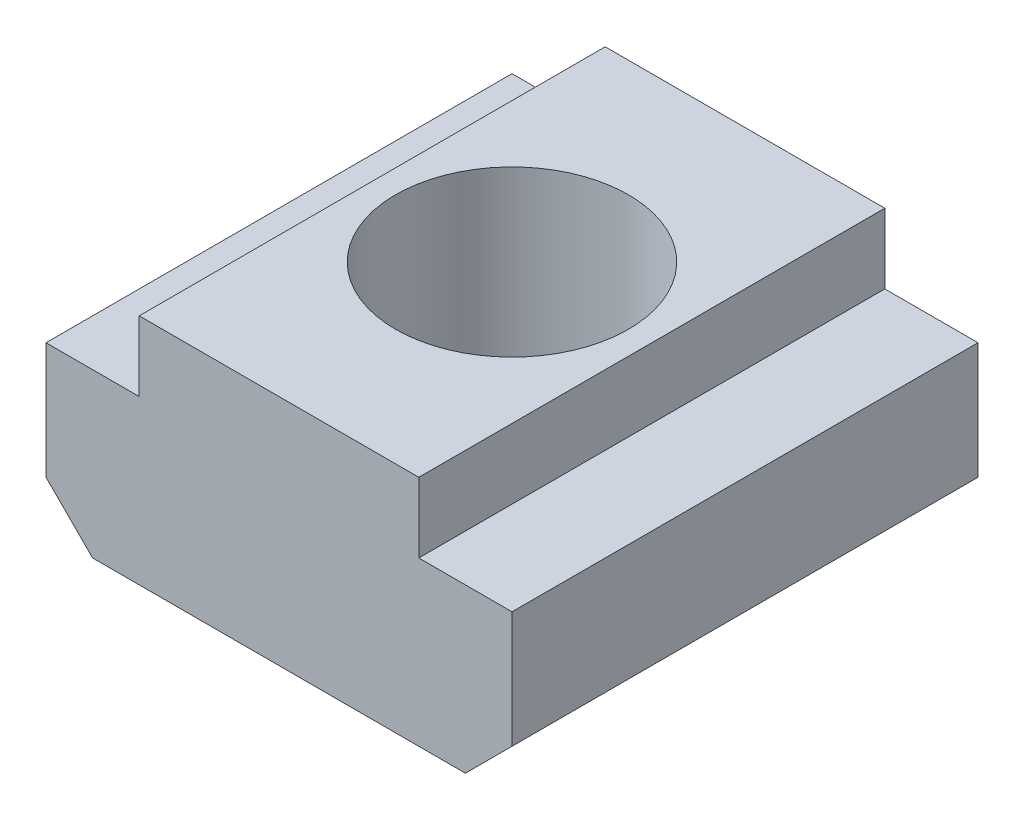
ISO-10303-21;
HEADER;
FILE_DESCRIPTION(('STEP AP214'),'2;1');
FILE_NAME('part.step','',(''),(''),'','','');
FILE_SCHEMA(('AUTOMOTIVE_DESIGN { 1 0 10303 214 1 1 1 1 }'));
ENDSEC;
DATA;
#1=APPLICATION_CONTEXT('core data for automotive mechanical design processes');
#2=APPLICATION_PROTOCOL_DEFINITION('international standard','automotive_design',2000,#1);
#3=PRODUCT_CONTEXT('',#1,'mechanical');
#4=PRODUCT('Part','Part','',(#3));
#5=PRODUCT_RELATED_PRODUCT_CATEGORY('part','',(#4));
#6=PRODUCT_DEFINITION_FORMATION('','',#4);
#7=PRODUCT_DEFINITION_CONTEXT('part definition',#1,'design');
#8=PRODUCT_DEFINITION('design','',#6,#7);
#9=PRODUCT_DEFINITION_SHAPE('','',#8);
#10=(LENGTH_UNIT() NAMED_UNIT(*) SI_UNIT(.MILLI.,.METRE.));
#11=(NAMED_UNIT(*) PLANE_ANGLE_UNIT() SI_UNIT($,.RADIAN.));
#12=(NAMED_UNIT(*) SI_UNIT($,.STERADIAN.) SOLID_ANGLE_UNIT());
#13=UNCERTAINTY_MEASURE_WITH_UNIT(LENGTH_MEASURE(1.E-05),#10,'distance_accuracy_value','');
#14=(GEOMETRIC_REPRESENTATION_CONTEXT(3) GLOBAL_UNCERTAINTY_ASSIGNED_CONTEXT((#13)) GLOBAL_UNIT_ASSIGNED_CONTEXT((#10,
#11,#12)) REPRESENTATION_CONTEXT('',''));
#15=CARTESIAN_POINT('',(0.,0.,0.));
#16=DIRECTION('',(0.,0.,1.));
#17=DIRECTION('',(1.,0.,0.));
#18=AXIS2_PLACEMENT_3D('',#15,#16,#17);
#19=CARTESIAN_POINT('',(-5.,1.,10.));
#20=DIRECTION('',(0.707106781186548,0.707106781186548,0.));
#21=DIRECTION('',(-0.707106781186548,0.707106781186548,0.));
#22=AXIS2_PLACEMENT_3D('',#19,#20,#21);
#23=PLANE('',#22);
#24=DIRECTION('',(0.707106781186548,-0.707106781186548,0.));
#25=VECTOR('',#24,1.);
#26=CARTESIAN_POINT('',(-5.,1.,0.));
#27=LINE('',#26,#25);
#28=CARTESIAN_POINT('',(-5.,1.,0.));
#29=VERTEX_POINT('',#28);
#30=CARTESIAN_POINT('',(-4.,0.,0.));
#31=VERTEX_POINT('',#30);
#32=EDGE_CURVE('E145',#29,#31,#27,.T.);
#33=ORIENTED_EDGE('',*,*,#32,.T.);
#34=DIRECTION('',(0.,0.,-1.));
#35=VECTOR('',#34,1.);
#36=CARTESIAN_POINT('',(-4.,0.,10.));
#37=LINE('',#36,#35);
#38=CARTESIAN_POINT('',(-4.,0.,10.));
#39=VERTEX_POINT('',#38);
#40=EDGE_CURVE('E11',#39,#31,#37,.T.);
#41=ORIENTED_EDGE('',*,*,#40,.F.);
#42=DIRECTION('',(0.707106781186548,-0.707106781186548,0.));
#43=VECTOR('',#42,1.);
#44=CARTESIAN_POINT('',(-5.,1.,10.));
#45=LINE('',#44,#43);
#46=CARTESIAN_POINT('',(-5.,1.,10.));
#47=VERTEX_POINT('',#46);
#48=EDGE_CURVE('E164',#47,#39,#45,.T.);
#49=ORIENTED_EDGE('',*,*,#48,.F.);
#50=DIRECTION('',(0.,0.,-1.));
#51=VECTOR('',#50,1.);
#52=CARTESIAN_POINT('',(-5.,1.,10.));
#53=LINE('',#52,#51);
#54=EDGE_CURVE('E141',#47,#29,#53,.T.);
#55=ORIENTED_EDGE('',*,*,#54,.T.);
#56=EDGE_LOOP('',(#33,#41,#49,#55));
#57=FACE_BOUND('',#56,.T.);
#58=ADVANCED_FACE('F37',(#57),#23,.F.);
#59=CARTESIAN_POINT('',(-4.,0.,10.));
#60=DIRECTION('',(0.,1.,0.));
#61=DIRECTION('',(0.,0.,1.));
#62=AXIS2_PLACEMENT_3D('',#59,#60,#61);
#63=PLANE('',#62);
#64=CARTESIAN_POINT('',(0.,0.,5.));
#65=DIRECTION('',(0.,1.,0.));
#66=DIRECTION('',(0.,0.,1.));
#67=AXIS2_PLACEMENT_3D('',#64,#65,#66);
#68=CIRCLE('',#67,2.5);
#69=CARTESIAN_POINT('',(0.,0.,7.5));
#70=VERTEX_POINT('',#69);
#71=EDGE_CURVE('E149',#70,#70,#68,.T.);
#72=ORIENTED_EDGE('',*,*,#71,.T.);
#73=EDGE_LOOP('',(#72));
#74=FACE_BOUND('',#73,.T.);
#75=DIRECTION('',(1.,0.,0.));
#76=VECTOR('',#75,1.);
#77=CARTESIAN_POINT('',(-4.,0.,0.));
#78=LINE('',#77,#76);
#79=CARTESIAN_POINT('',(4.,0.,0.));
#80=VERTEX_POINT('',#79);
#81=EDGE_CURVE('E148',#31,#80,#78,.T.);
#82=ORIENTED_EDGE('',*,*,#81,.T.);
#83=DIRECTION('',(0.,0.,-1.));
#84=VECTOR('',#83,1.);
#85=CARTESIAN_POINT('',(4.,0.,10.));
#86=LINE('',#85,#84);
#87=CARTESIAN_POINT('',(4.,0.,10.));
#88=VERTEX_POINT('',#87);
#89=EDGE_CURVE('E45',#88,#80,#86,.T.);
#90=ORIENTED_EDGE('',*,*,#89,.F.);
#91=DIRECTION('',(1.,0.,0.));
#92=VECTOR('',#91,1.);
#93=CARTESIAN_POINT('',(-4.,0.,10.));
#94=LINE('',#93,#92);
#95=EDGE_CURVE('E102',#39,#88,#94,.T.);
#96=ORIENTED_EDGE('',*,*,#95,.F.);
#97=ORIENTED_EDGE('',*,*,#40,.T.);
#98=EDGE_LOOP('',(#82,#90,#96,#97));
#99=FACE_BOUND('',#98,.T.);
#100=ADVANCED_FACE('F240',(#74,#99),#63,.F.);
#101=CARTESIAN_POINT('',(4.,0.,10.));
#102=DIRECTION('',(-0.707106781186548,0.707106781186548,0.));
#103=DIRECTION('',(-0.707106781186548,-0.707106781186548,0.));
#104=AXIS2_PLACEMENT_3D('',#101,#102,#103);
#105=PLANE('',#104);
#106=DIRECTION('',(0.707106781186548,0.707106781186548,0.));
#107=VECTOR('',#106,1.);
#108=CARTESIAN_POINT('',(4.,0.,0.));
#109=LINE('',#108,#107);
#110=CARTESIAN_POINT('',(5.,1.,0.));
#111=VERTEX_POINT('',#110);
#112=EDGE_CURVE('E151',#80,#111,#109,.T.);
#113=ORIENTED_EDGE('',*,*,#112,.T.);
#114=DIRECTION('',(0.,0.,-1.));
#115=VECTOR('',#114,1.);
#116=CARTESIAN_POINT('',(5.,1.,10.));
#117=LINE('',#116,#115);
#118=CARTESIAN_POINT('',(5.,1.,10.));
#119=VERTEX_POINT('',#118);
#120=EDGE_CURVE('E177',#119,#111,#117,.T.);
#121=ORIENTED_EDGE('',*,*,#120,.F.);
#122=DIRECTION('',(0.707106781186548,0.707106781186548,0.));
#123=VECTOR('',#122,1.);
#124=CARTESIAN_POINT('',(4.,0.,10.));
#125=LINE('',#124,#123);
#126=EDGE_CURVE('E185',#88,#119,#125,.T.);
#127=ORIENTED_EDGE('',*,*,#126,.F.);
#128=ORIENTED_EDGE('',*,*,#89,.T.);
#129=EDGE_LOOP('',(#113,#121,#127,#128));
#130=FACE_BOUND('',#129,.T.);
#131=ADVANCED_FACE('F183',(#130),#105,.F.);
#132=CARTESIAN_POINT('',(5.,1.,10.));
#133=DIRECTION('',(-1.,0.,0.));
#134=DIRECTION('',(0.,0.,1.));
#135=AXIS2_PLACEMENT_3D('',#132,#133,#134);
#136=PLANE('',#135);
#137=DIRECTION('',(0.,1.,0.));
#138=VECTOR('',#137,1.);
#139=CARTESIAN_POINT('',(5.,1.,0.));
#140=LINE('',#139,#138);
#141=CARTESIAN_POINT('',(5.,3.5,0.));
#142=VERTEX_POINT('',#141);
#143=EDGE_CURVE('E153',#111,#142,#140,.T.);
#144=ORIENTED_EDGE('',*,*,#143,.T.);
#145=DIRECTION('',(0.,0.,-1.));
#146=VECTOR('',#145,1.);
#147=CARTESIAN_POINT('',(5.,3.5,10.));
#148=LINE('',#147,#146);
#149=CARTESIAN_POINT('',(5.,3.5,10.));
#150=VERTEX_POINT('',#149);
#151=EDGE_CURVE('E174',#150,#142,#148,.T.);
#152=ORIENTED_EDGE('',*,*,#151,.F.);
#153=DIRECTION('',(0.,1.,0.));
#154=VECTOR('',#153,1.);
#155=CARTESIAN_POINT('',(5.,1.,10.));
#156=LINE('',#155,#154);
#157=EDGE_CURVE('E203',#119,#150,#156,.T.);
#158=ORIENTED_EDGE('',*,*,#157,.F.);
#159=ORIENTED_EDGE('',*,*,#120,.T.);
#160=EDGE_LOOP('',(#144,#152,#158,#159));
#161=FACE_BOUND('',#160,.T.);
#162=ADVANCED_FACE('F194',(#161),#136,.F.);
#163=CARTESIAN_POINT('',(5.,3.5,10.));
#164=DIRECTION('',(0.,-1.,0.));
#165=DIRECTION('',(1.,0.,0.));
#166=AXIS2_PLACEMENT_3D('',#163,#164,#165);
#167=PLANE('',#166);
#168=DIRECTION('',(-1.,0.,0.));
#169=VECTOR('',#168,1.);
#170=CARTESIAN_POINT('',(5.,3.5,0.));
#171=LINE('',#170,#169);
#172=CARTESIAN_POINT('',(3.,3.5,0.));
#173=VERTEX_POINT('',#172);
#174=EDGE_CURVE('E155',#142,#173,#171,.T.);
#175=ORIENTED_EDGE('',*,*,#174,.T.);
#176=DIRECTION('',(0.,0.,-1.));
#177=VECTOR('',#176,1.);
#178=CARTESIAN_POINT('',(3.,3.5,10.));
#179=LINE('',#178,#177);
#180=CARTESIAN_POINT('',(3.,3.5,10.));
#181=VERTEX_POINT('',#180);
#182=EDGE_CURVE('E171',#181,#173,#179,.T.);
#183=ORIENTED_EDGE('',*,*,#182,.F.);
#184=DIRECTION('',(-1.,0.,0.));
#185=VECTOR('',#184,1.);
#186=CARTESIAN_POINT('',(5.,3.5,10.));
#187=LINE('',#186,#185);
#188=EDGE_CURVE('E200',#150,#181,#187,.T.);
#189=ORIENTED_EDGE('',*,*,#188,.F.);
#190=ORIENTED_EDGE('',*,*,#151,.T.);
#191=EDGE_LOOP('',(#175,#183,#189,#190));
#192=FACE_BOUND('',#191,.T.);
#193=ADVANCED_FACE('F198',(#192),#167,.F.);
#194=CARTESIAN_POINT('',(3.,3.5,10.));
#195=DIRECTION('',(-1.,0.,0.));
#196=DIRECTION('',(0.,-1.,0.));
#197=AXIS2_PLACEMENT_3D('',#194,#195,#196);
#198=PLANE('',#197);
#199=DIRECTION('',(0.,1.,0.));
#200=VECTOR('',#199,1.);
#201=CARTESIAN_POINT('',(3.,3.5,0.));
#202=LINE('',#201,#200);
#203=CARTESIAN_POINT('',(3.,5.,0.));
#204=VERTEX_POINT('',#203);
#205=EDGE_CURVE('E157',#173,#204,#202,.T.);
#206=ORIENTED_EDGE('',*,*,#205,.T.);
#207=DIRECTION('',(0.,0.,-1.));
#208=VECTOR('',#207,1.);
#209=CARTESIAN_POINT('',(3.,5.,10.));
#210=LINE('',#209,#208);
#211=CARTESIAN_POINT('',(3.,5.,10.));
#212=VERTEX_POINT('',#211);
#213=EDGE_CURVE('E168',#212,#204,#210,.T.);
#214=ORIENTED_EDGE('',*,*,#213,.F.);
#215=DIRECTION('',(0.,1.,0.));
#216=VECTOR('',#215,1.);
#217=CARTESIAN_POINT('',(3.,3.5,10.));
#218=LINE('',#217,#216);
#219=EDGE_CURVE('E202',#181,#212,#218,.T.);
#220=ORIENTED_EDGE('',*,*,#219,.F.);
#221=ORIENTED_EDGE('',*,*,#182,.T.);
#222=EDGE_LOOP('',(#206,#214,#220,#221));
#223=FACE_BOUND('',#222,.T.);
#224=ADVANCED_FACE('F222',(#223),#198,.F.);
#225=CARTESIAN_POINT('',(3.,5.,10.));
#226=DIRECTION('',(0.,-1.,0.));
#227=DIRECTION('',(0.,0.,-1.));
#228=AXIS2_PLACEMENT_3D('',#225,#226,#227);
#229=PLANE('',#228);
#230=CARTESIAN_POINT('',(0.,5.,5.));
#231=DIRECTION('',(0.,1.,0.));
#232=DIRECTION('',(0.,0.,1.));
#233=AXIS2_PLACEMENT_3D('',#230,#231,#232);
#234=CIRCLE('',#233,2.5);
#235=CARTESIAN_POINT('',(0.,5.,7.5));
#236=VERTEX_POINT('',#235);
#237=EDGE_CURVE('E213',#236,#236,#234,.T.);
#238=ORIENTED_EDGE('',*,*,#237,.F.);
#239=EDGE_LOOP('',(#238));
#240=FACE_BOUND('',#239,.T.);
#241=DIRECTION('',(-1.,0.,0.));
#242=VECTOR('',#241,1.);
#243=CARTESIAN_POINT('',(3.,5.,0.));
#244=LINE('',#243,#242);
#245=CARTESIAN_POINT('',(-3.,5.,0.));
#246=VERTEX_POINT('',#245);
#247=EDGE_CURVE('E159',#204,#246,#244,.T.);
#248=ORIENTED_EDGE('',*,*,#247,.T.);
#249=DIRECTION('',(0.,0.,-1.));
#250=VECTOR('',#249,1.);
#251=CARTESIAN_POINT('',(-3.,5.,10.));
#252=LINE('',#251,#250);
#253=CARTESIAN_POINT('',(-3.,5.,10.));
#254=VERTEX_POINT('',#253);
#255=EDGE_CURVE('E136',#254,#246,#252,.T.);
#256=ORIENTED_EDGE('',*,*,#255,.F.);
#257=DIRECTION('',(-1.,0.,0.));
#258=VECTOR('',#257,1.);
#259=CARTESIAN_POINT('',(3.,5.,10.));
#260=LINE('',#259,#258);
#261=EDGE_CURVE('E127',#212,#254,#260,.T.);
#262=ORIENTED_EDGE('',*,*,#261,.F.);
#263=ORIENTED_EDGE('',*,*,#213,.T.);
#264=EDGE_LOOP('',(#248,#256,#262,#263));
#265=FACE_BOUND('',#264,.T.);
#266=ADVANCED_FACE('F219',(#240,#265),#229,.F.);
#267=CARTESIAN_POINT('',(-3.,5.,10.));
#268=DIRECTION('',(1.,0.,0.));
#269=DIRECTION('',(0.,1.,0.));
#270=AXIS2_PLACEMENT_3D('',#267,#268,#269);
#271=PLANE('',#270);
#272=DIRECTION('',(0.,-1.,0.));
#273=VECTOR('',#272,1.);
#274=CARTESIAN_POINT('',(-3.,5.,0.));
#275=LINE('',#274,#273);
#276=CARTESIAN_POINT('',(-3.,3.5,0.));
#277=VERTEX_POINT('',#276);
#278=EDGE_CURVE('E135',#246,#277,#275,.T.);
#279=ORIENTED_EDGE('',*,*,#278,.T.);
#280=DIRECTION('',(0.,0.,-1.));
#281=VECTOR('',#280,1.);
#282=CARTESIAN_POINT('',(-3.,3.5,10.));
#283=LINE('',#282,#281);
#284=CARTESIAN_POINT('',(-3.,3.5,10.));
#285=VERTEX_POINT('',#284);
#286=EDGE_CURVE('E132',#285,#277,#283,.T.);
#287=ORIENTED_EDGE('',*,*,#286,.F.);
#288=DIRECTION('',(0.,-1.,0.));
#289=VECTOR('',#288,1.);
#290=CARTESIAN_POINT('',(-3.,5.,10.));
#291=LINE('',#290,#289);
#292=EDGE_CURVE('E121',#254,#285,#291,.T.);
#293=ORIENTED_EDGE('',*,*,#292,.F.);
#294=ORIENTED_EDGE('',*,*,#255,.T.);
#295=EDGE_LOOP('',(#279,#287,#293,#294));
#296=FACE_BOUND('',#295,.T.);
#297=ADVANCED_FACE('F133',(#296),#271,.F.);
#298=CARTESIAN_POINT('',(-3.,3.5,10.));
#299=DIRECTION('',(0.,-1.,0.));
#300=DIRECTION('',(0.,0.,-1.));
#301=AXIS2_PLACEMENT_3D('',#298,#299,#300);
#302=PLANE('',#301);
#303=DIRECTION('',(-1.,0.,0.));
#304=VECTOR('',#303,1.);
#305=CARTESIAN_POINT('',(-3.,3.5,0.));
#306=LINE('',#305,#304);
#307=CARTESIAN_POINT('',(-5.,3.5,0.));
#308=VERTEX_POINT('',#307);
#309=EDGE_CURVE('E88',#277,#308,#306,.T.);
#310=ORIENTED_EDGE('',*,*,#309,.T.);
#311=DIRECTION('',(0.,0.,-1.));
#312=VECTOR('',#311,1.);
#313=CARTESIAN_POINT('',(-5.,3.5,10.));
#314=LINE('',#313,#312);
#315=CARTESIAN_POINT('',(-5.,3.5,10.));
#316=VERTEX_POINT('',#315);
#317=EDGE_CURVE('E137',#316,#308,#314,.T.);
#318=ORIENTED_EDGE('',*,*,#317,.F.);
#319=DIRECTION('',(-1.,0.,0.));
#320=VECTOR('',#319,1.);
#321=CARTESIAN_POINT('',(-3.,3.5,10.));
#322=LINE('',#321,#320);
#323=EDGE_CURVE('E125',#285,#316,#322,.T.);
#324=ORIENTED_EDGE('',*,*,#323,.F.);
#325=ORIENTED_EDGE('',*,*,#286,.T.);
#326=EDGE_LOOP('',(#310,#318,#324,#325));
#327=FACE_BOUND('',#326,.T.);
#328=ADVANCED_FACE('F139',(#327),#302,.F.);
#329=CARTESIAN_POINT('',(-5.,3.5,10.));
#330=DIRECTION('',(1.,0.,0.));
#331=DIRECTION('',(0.,1.,0.));
#332=AXIS2_PLACEMENT_3D('',#329,#330,#331);
#333=PLANE('',#332);
#334=DIRECTION('',(0.,-1.,0.));
#335=VECTOR('',#334,1.);
#336=CARTESIAN_POINT('',(-5.,3.5,0.));
#337=LINE('',#336,#335);
#338=EDGE_CURVE('E94',#308,#29,#337,.T.);
#339=ORIENTED_EDGE('',*,*,#338,.T.);
#340=ORIENTED_EDGE('',*,*,#54,.F.);
#341=DIRECTION('',(0.,-1.,0.));
#342=VECTOR('',#341,1.);
#343=CARTESIAN_POINT('',(-5.,3.5,10.));
#344=LINE('',#343,#342);
#345=EDGE_CURVE('E53',#316,#47,#344,.T.);
#346=ORIENTED_EDGE('',*,*,#345,.F.);
#347=ORIENTED_EDGE('',*,*,#317,.T.);
#348=EDGE_LOOP('',(#339,#340,#346,#347));
#349=FACE_BOUND('',#348,.T.);
#350=ADVANCED_FACE('F229',(#349),#333,.F.);
#351=CARTESIAN_POINT('',(0.,0.,10.));
#352=DIRECTION('',(0.,0.,1.));
#353=DIRECTION('',(1.,0.,0.));
#354=AXIS2_PLACEMENT_3D('',#351,#352,#353);
#355=PLANE('',#354);
#356=ORIENTED_EDGE('',*,*,#48,.T.);
#357=ORIENTED_EDGE('',*,*,#95,.T.);
#358=ORIENTED_EDGE('',*,*,#126,.T.);
#359=ORIENTED_EDGE('',*,*,#157,.T.);
#360=ORIENTED_EDGE('',*,*,#188,.T.);
#361=ORIENTED_EDGE('',*,*,#219,.T.);
#362=ORIENTED_EDGE('',*,*,#261,.T.);
#363=ORIENTED_EDGE('',*,*,#292,.T.);
#364=ORIENTED_EDGE('',*,*,#323,.T.);
#365=ORIENTED_EDGE('',*,*,#345,.T.);
#366=EDGE_LOOP('',(#356,#357,#358,#359,#360,#361,#362,#363,#364,#365));
#367=FACE_BOUND('',#366,.T.);
#368=ADVANCED_FACE('F123',(#367),#355,.T.);
#369=CARTESIAN_POINT('',(0.,0.,0.));
#370=DIRECTION('',(0.,0.,1.));
#371=DIRECTION('',(1.,0.,0.));
#372=AXIS2_PLACEMENT_3D('',#369,#370,#371);
#373=PLANE('',#372);
#374=ORIENTED_EDGE('',*,*,#32,.F.);
#375=ORIENTED_EDGE('',*,*,#338,.F.);
#376=ORIENTED_EDGE('',*,*,#309,.F.);
#377=ORIENTED_EDGE('',*,*,#278,.F.);
#378=ORIENTED_EDGE('',*,*,#247,.F.);
#379=ORIENTED_EDGE('',*,*,#205,.F.);
#380=ORIENTED_EDGE('',*,*,#174,.F.);
#381=ORIENTED_EDGE('',*,*,#143,.F.);
#382=ORIENTED_EDGE('',*,*,#112,.F.);
#383=ORIENTED_EDGE('',*,*,#81,.F.);
#384=EDGE_LOOP('',(#374,#375,#376,#377,#378,#379,#380,#381,#382,#383));
#385=FACE_BOUND('',#384,.T.);
#386=ADVANCED_FACE('F189',(#385),#373,.F.);
#387=CARTESIAN_POINT('',(0.,5.,5.));
#388=DIRECTION('',(0.,1.,0.));
#389=DIRECTION('',(0.,0.,1.));
#390=AXIS2_PLACEMENT_3D('',#387,#388,#389);
#391=CYLINDRICAL_SURFACE('',#390,2.5);
#392=ORIENTED_EDGE('',*,*,#71,.F.);
#393=EDGE_LOOP('',(#392));
#394=FACE_BOUND('',#393,.T.);
#395=ORIENTED_EDGE('',*,*,#237,.T.);
#396=EDGE_LOOP('',(#395));
#397=FACE_BOUND('',#396,.T.);
#398=ADVANCED_FACE('F217',(#394,#397),#391,.F.);
#399=CLOSED_SHELL('',(#58,#100,#131,#162,#193,#224,#266,#297,#328,#350,#368,#386,#398));
#400=MANIFOLD_SOLID_BREP('B2',#399);
#401=ADVANCED_BREP_SHAPE_REPRESENTATION('',(#18,#400),#14);
#402=SHAPE_DEFINITION_REPRESENTATION(#9,#401);
ENDSEC;
END-ISO-10303-21;
